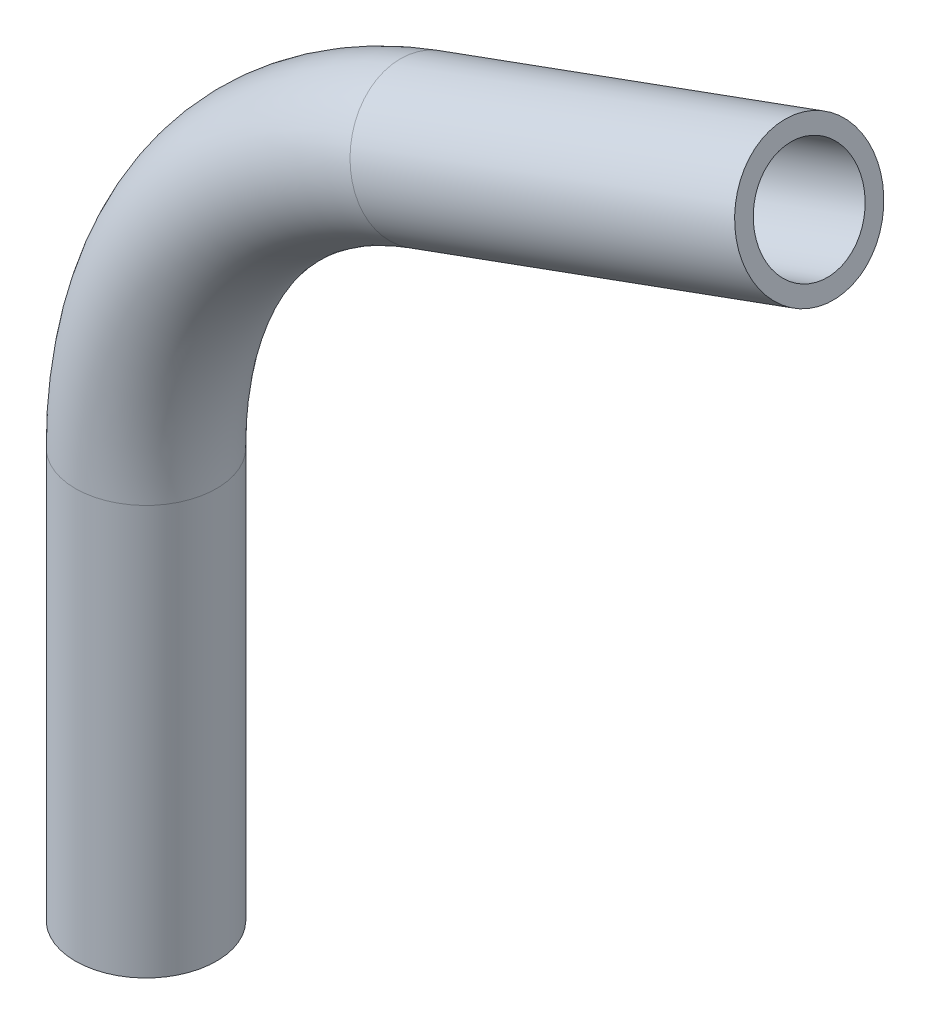
ISO-10303-21;
HEADER;
FILE_DESCRIPTION(('STEP AP214'),'2;1');
FILE_NAME('part.step','',(''),(''),'','','');
FILE_SCHEMA(('AUTOMOTIVE_DESIGN { 1 0 10303 214 1 1 1 1 }'));
ENDSEC;
DATA;
#1=APPLICATION_CONTEXT('core data for automotive mechanical design processes');
#2=APPLICATION_PROTOCOL_DEFINITION('international standard','automotive_design',2000,#1);
#3=PRODUCT_CONTEXT('',#1,'mechanical');
#4=PRODUCT('Part','Part','',(#3));
#5=PRODUCT_RELATED_PRODUCT_CATEGORY('part','',(#4));
#6=PRODUCT_DEFINITION_FORMATION('','',#4);
#7=PRODUCT_DEFINITION_CONTEXT('part definition',#1,'design');
#8=PRODUCT_DEFINITION('design','',#6,#7);
#9=PRODUCT_DEFINITION_SHAPE('','',#8);
#10=(LENGTH_UNIT() NAMED_UNIT(*) SI_UNIT(.MILLI.,.METRE.));
#11=(NAMED_UNIT(*) PLANE_ANGLE_UNIT() SI_UNIT($,.RADIAN.));
#12=(NAMED_UNIT(*) SI_UNIT($,.STERADIAN.) SOLID_ANGLE_UNIT());
#13=UNCERTAINTY_MEASURE_WITH_UNIT(LENGTH_MEASURE(1.E-05),#10,'distance_accuracy_value','');
#14=(GEOMETRIC_REPRESENTATION_CONTEXT(3) GLOBAL_UNCERTAINTY_ASSIGNED_CONTEXT((#13)) GLOBAL_UNIT_ASSIGNED_CONTEXT((#10,
#11,#12)) REPRESENTATION_CONTEXT('',''));
#15=CARTESIAN_POINT('',(0.,0.,0.));
#16=DIRECTION('',(0.,0.,1.));
#17=DIRECTION('',(1.,0.,0.));
#18=AXIS2_PLACEMENT_3D('',#15,#16,#17);
#19=CARTESIAN_POINT('',(0.,0.,0.));
#20=DIRECTION('',(0.,1.,0.));
#21=DIRECTION('',(0.,0.,1.));
#22=AXIS2_PLACEMENT_3D('',#19,#20,#21);
#23=CYLINDRICAL_SURFACE('',#22,4.);
#24=CARTESIAN_POINT('',(0.,23.1950190829669,0.));
#25=DIRECTION('',(0.,1.,0.));
#26=DIRECTION('',(0.,0.,1.));
#27=AXIS2_PLACEMENT_3D('',#24,#25,#26);
#28=CIRCLE('',#27,4.);
#29=CARTESIAN_POINT('',(-4.,23.1950190829669,0.));
#30=VERTEX_POINT('',#29);
#31=EDGE_CURVE('E78',#30,#30,#28,.T.);
#32=ORIENTED_EDGE('',*,*,#31,.F.);
#33=EDGE_LOOP('',(#32));
#34=FACE_BOUND('',#33,.T.);
#35=CARTESIAN_POINT('',(0.,0.,0.));
#36=DIRECTION('',(0.,1.,0.));
#37=DIRECTION('',(0.,0.,1.));
#38=AXIS2_PLACEMENT_3D('',#35,#36,#37);
#39=CIRCLE('',#38,4.);
#40=CARTESIAN_POINT('',(0.,0.,4.));
#41=VERTEX_POINT('',#40);
#42=EDGE_CURVE('E47',#41,#41,#39,.T.);
#43=ORIENTED_EDGE('',*,*,#42,.T.);
#44=EDGE_LOOP('',(#43));
#45=FACE_BOUND('',#44,.T.);
#46=ADVANCED_FACE('F32',(#34,#45),#23,.T.);
#47=CARTESIAN_POINT('',(24.,23.1950190829669,0.));
#48=DIRECTION('',(0.,0.,-1.));
#49=DIRECTION('',(-1.,0.,0.));
#50=AXIS2_PLACEMENT_3D('',#47,#48,#49);
#51=TOROIDAL_SURFACE('',#50,24.,4.);
#52=CARTESIAN_POINT('',(15.791516560184,45.7476419818287,0.));
#53=DIRECTION('',(0.939692620785909,0.342020143325666,0.));
#54=DIRECTION('',(0.,0.,1.));
#55=AXIS2_PLACEMENT_3D('',#52,#53,#54);
#56=CIRCLE('',#55,4.);
#57=CARTESIAN_POINT('',(14.4234359868814,49.5064124649724,0.));
#58=VERTEX_POINT('',#57);
#59=EDGE_CURVE('E36',#58,#58,#56,.T.);
#60=CARTESIAN_POINT('',(24.,23.1950190829669,0.));
#61=DIRECTION('',(0.,0.,-1.));
#62=DIRECTION('',(-1.,0.,0.));
#63=AXIS2_PLACEMENT_3D('',#60,#61,#62);
#64=CIRCLE('',#63,28.);
#65=EDGE_CURVE('',#30,#58,#64,.T.);
#66=ORIENTED_EDGE('',*,*,#31,.T.);
#67=ORIENTED_EDGE('',*,*,#59,.F.);
#68=ORIENTED_EDGE('',*,*,#65,.T.);
#69=ORIENTED_EDGE('',*,*,#65,.F.);
#70=EDGE_LOOP('',(#66,#68,#67,#69));
#71=FACE_BOUND('',#70,.T.);
#72=ADVANCED_FACE('F86',(#71),#51,.T.);
#73=CARTESIAN_POINT('',(15.791516560184,45.7476419818287,0.));
#74=DIRECTION('',(0.939692620785909,0.342020143325666,0.));
#75=DIRECTION('',(-0.342020143325666,0.939692620785909,0.));
#76=AXIS2_PLACEMENT_3D('',#73,#74,#75);
#77=CYLINDRICAL_SURFACE('',#76,4.);
#78=CARTESIAN_POINT('',(37.5877048314364,53.6808057330266,0.));
#79=DIRECTION('',(0.939692620785909,0.342020143325666,0.));
#80=DIRECTION('',(0.,0.,1.));
#81=AXIS2_PLACEMENT_3D('',#78,#79,#80);
#82=CIRCLE('',#81,4.);
#83=CARTESIAN_POINT('',(37.5877048314364,53.6808057330266,4.));
#84=VERTEX_POINT('',#83);
#85=EDGE_CURVE('E52',#84,#84,#82,.T.);
#86=ORIENTED_EDGE('',*,*,#85,.F.);
#87=EDGE_LOOP('',(#86));
#88=FACE_BOUND('',#87,.T.);
#89=ORIENTED_EDGE('',*,*,#59,.T.);
#90=EDGE_LOOP('',(#89));
#91=FACE_BOUND('',#90,.T.);
#92=ADVANCED_FACE('F34',(#88,#91),#77,.T.);
#93=CARTESIAN_POINT('',(0.,0.,0.));
#94=DIRECTION('',(0.,1.,0.));
#95=DIRECTION('',(0.,0.,1.));
#96=AXIS2_PLACEMENT_3D('',#93,#94,#95);
#97=PLANE('',#96);
#98=CARTESIAN_POINT('',(0.,0.,0.));
#99=DIRECTION('',(0.,1.,0.));
#100=DIRECTION('',(0.,0.,1.));
#101=AXIS2_PLACEMENT_3D('',#98,#99,#100);
#102=CIRCLE('',#101,3.);
#103=CARTESIAN_POINT('',(0.,0.,3.));
#104=VERTEX_POINT('',#103);
#105=EDGE_CURVE('E73',#104,#104,#102,.F.);
#106=ORIENTED_EDGE('',*,*,#105,.F.);
#107=EDGE_LOOP('',(#106));
#108=FACE_BOUND('',#107,.T.);
#109=ORIENTED_EDGE('',*,*,#42,.F.);
#110=EDGE_LOOP('',(#109));
#111=FACE_BOUND('',#110,.T.);
#112=ADVANCED_FACE('F92',(#108,#111),#97,.F.);
#113=CARTESIAN_POINT('',(37.5877048314364,53.6808057330266,0.));
#114=DIRECTION('',(0.939692620785909,0.342020143325666,0.));
#115=DIRECTION('',(0.,0.,1.));
#116=AXIS2_PLACEMENT_3D('',#113,#114,#115);
#117=PLANE('',#116);
#118=CARTESIAN_POINT('',(37.5877048314364,53.6808057330266,0.));
#119=DIRECTION('',(0.939692620785909,0.342020143325666,0.));
#120=DIRECTION('',(0.,0.,1.));
#121=AXIS2_PLACEMENT_3D('',#118,#119,#120);
#122=CIRCLE('',#121,3.);
#123=CARTESIAN_POINT('',(37.5877048314364,53.6808057330266,3.));
#124=VERTEX_POINT('',#123);
#125=EDGE_CURVE('E11',#124,#124,#122,.F.);
#126=ORIENTED_EDGE('',*,*,#125,.T.);
#127=EDGE_LOOP('',(#126));
#128=FACE_BOUND('',#127,.T.);
#129=ORIENTED_EDGE('',*,*,#85,.T.);
#130=EDGE_LOOP('',(#129));
#131=FACE_BOUND('',#130,.T.);
#132=ADVANCED_FACE('F59',(#128,#131),#117,.T.);
#133=CARTESIAN_POINT('',(0.,0.,0.));
#134=DIRECTION('',(0.,1.,0.));
#135=DIRECTION('',(0.,0.,1.));
#136=AXIS2_PLACEMENT_3D('',#133,#134,#135);
#137=CYLINDRICAL_SURFACE('',#136,3.);
#138=CARTESIAN_POINT('',(0.,23.1950190829669,0.));
#139=DIRECTION('',(0.,1.,0.));
#140=DIRECTION('',(0.,0.,1.));
#141=AXIS2_PLACEMENT_3D('',#138,#139,#140);
#142=CIRCLE('',#141,3.);
#143=CARTESIAN_POINT('',(-3.,23.1950190829669,0.));
#144=VERTEX_POINT('',#143);
#145=EDGE_CURVE('E70',#144,#144,#142,.F.);
#146=ORIENTED_EDGE('',*,*,#145,.F.);
#147=EDGE_LOOP('',(#146));
#148=FACE_BOUND('',#147,.T.);
#149=ORIENTED_EDGE('',*,*,#105,.T.);
#150=EDGE_LOOP('',(#149));
#151=FACE_BOUND('',#150,.T.);
#152=ADVANCED_FACE('F100',(#148,#151),#137,.F.);
#153=CARTESIAN_POINT('',(24.,23.1950190829669,0.));
#154=DIRECTION('',(0.,0.,-1.));
#155=DIRECTION('',(-1.,0.,0.));
#156=AXIS2_PLACEMENT_3D('',#153,#154,#155);
#157=TOROIDAL_SURFACE('',#156,24.,3.);
#158=CARTESIAN_POINT('',(15.791516560184,45.7476419818287,0.));
#159=DIRECTION('',(0.939692620785909,0.342020143325666,0.));
#160=DIRECTION('',(0.,0.,1.));
#161=AXIS2_PLACEMENT_3D('',#158,#159,#160);
#162=CIRCLE('',#161,3.);
#163=CARTESIAN_POINT('',(14.765456130207,48.5667198441865,0.));
#164=VERTEX_POINT('',#163);
#165=EDGE_CURVE('E41',#164,#164,#162,.F.);
#166=CARTESIAN_POINT('',(24.,23.1950190829669,0.));
#167=DIRECTION('',(0.,0.,-1.));
#168=DIRECTION('',(-1.,0.,0.));
#169=AXIS2_PLACEMENT_3D('',#166,#167,#168);
#170=CIRCLE('',#169,27.);
#171=EDGE_CURVE('',#144,#164,#170,.T.);
#172=ORIENTED_EDGE('',*,*,#145,.T.);
#173=ORIENTED_EDGE('',*,*,#165,.F.);
#174=ORIENTED_EDGE('',*,*,#171,.T.);
#175=ORIENTED_EDGE('',*,*,#171,.F.);
#176=EDGE_LOOP('',(#172,#174,#173,#175));
#177=FACE_BOUND('',#176,.T.);
#178=ADVANCED_FACE('F65',(#177),#157,.F.);
#179=CARTESIAN_POINT('',(15.791516560184,45.7476419818287,0.));
#180=DIRECTION('',(0.939692620785909,0.342020143325666,0.));
#181=DIRECTION('',(-0.342020143325666,0.939692620785909,0.));
#182=AXIS2_PLACEMENT_3D('',#179,#180,#181);
#183=CYLINDRICAL_SURFACE('',#182,3.);
#184=ORIENTED_EDGE('',*,*,#125,.F.);
#185=EDGE_LOOP('',(#184));
#186=FACE_BOUND('',#185,.T.);
#187=ORIENTED_EDGE('',*,*,#165,.T.);
#188=EDGE_LOOP('',(#187));
#189=FACE_BOUND('',#188,.T.);
#190=ADVANCED_FACE('F62',(#186,#189),#183,.F.);
#191=CLOSED_SHELL('',(#46,#72,#92,#112,#132,#152,#178,#190));
#192=MANIFOLD_SOLID_BREP('B2',#191);
#193=ADVANCED_BREP_SHAPE_REPRESENTATION('',(#18,#192),#14);
#194=SHAPE_DEFINITION_REPRESENTATION(#9,#193);
ENDSEC;
END-ISO-10303-21;
